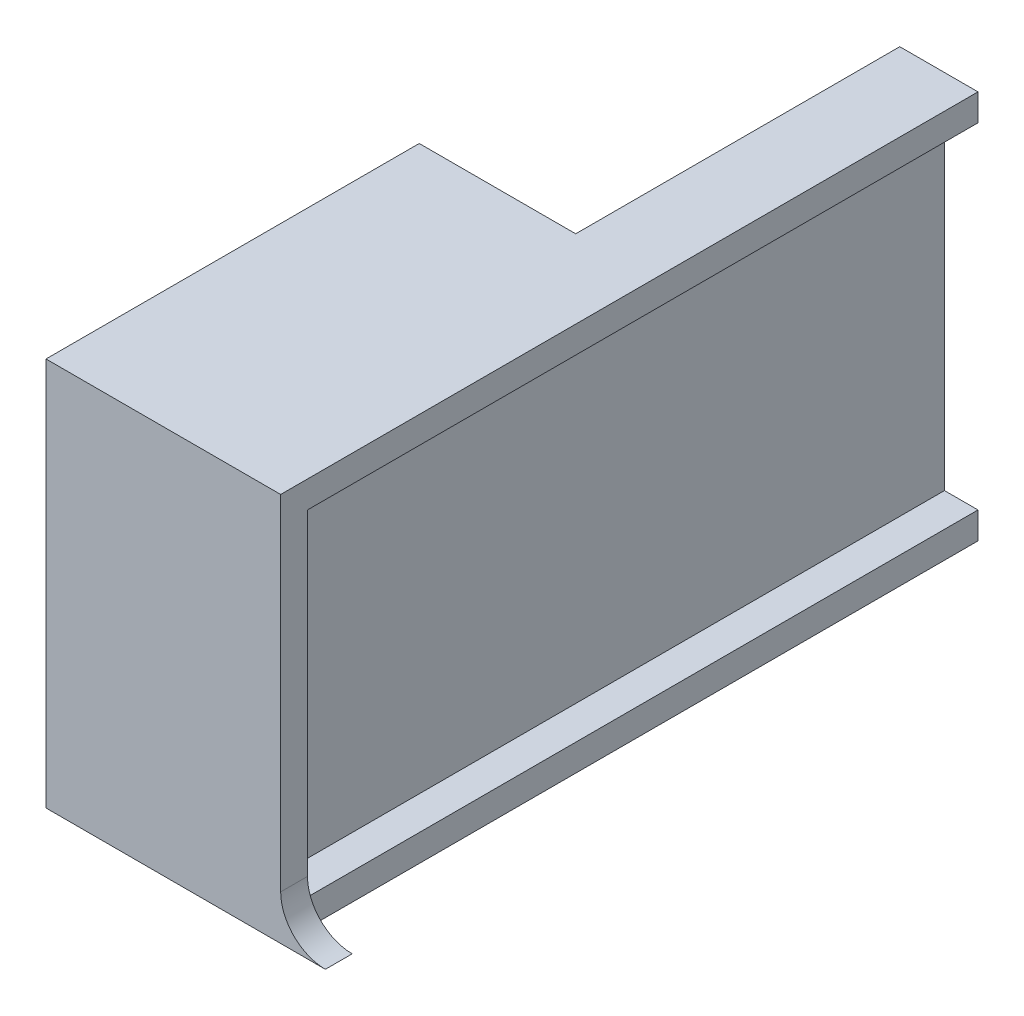
ISO-10303-21;
HEADER;
FILE_DESCRIPTION(('STEP AP214'),'2;1');
FILE_NAME('part.step','',(''),(''),'','','');
FILE_SCHEMA(('AUTOMOTIVE_DESIGN { 1 0 10303 214 1 1 1 1 }'));
ENDSEC;
DATA;
#1=APPLICATION_CONTEXT('core data for automotive mechanical design processes');
#2=APPLICATION_PROTOCOL_DEFINITION('international standard','automotive_design',2000,#1);
#3=PRODUCT_CONTEXT('',#1,'mechanical');
#4=PRODUCT('Part','Part','',(#3));
#5=PRODUCT_RELATED_PRODUCT_CATEGORY('part','',(#4));
#6=PRODUCT_DEFINITION_FORMATION('','',#4);
#7=PRODUCT_DEFINITION_CONTEXT('part definition',#1,'design');
#8=PRODUCT_DEFINITION('design','',#6,#7);
#9=PRODUCT_DEFINITION_SHAPE('','',#8);
#10=(LENGTH_UNIT() NAMED_UNIT(*) SI_UNIT(.MILLI.,.METRE.));
#11=(NAMED_UNIT(*) PLANE_ANGLE_UNIT() SI_UNIT($,.RADIAN.));
#12=(NAMED_UNIT(*) SI_UNIT($,.STERADIAN.) SOLID_ANGLE_UNIT());
#13=UNCERTAINTY_MEASURE_WITH_UNIT(LENGTH_MEASURE(1.E-05),#10,'distance_accuracy_value','');
#14=(GEOMETRIC_REPRESENTATION_CONTEXT(3) GLOBAL_UNCERTAINTY_ASSIGNED_CONTEXT((#13)) GLOBAL_UNIT_ASSIGNED_CONTEXT((#10,
#11,#12)) REPRESENTATION_CONTEXT('',''));
#15=CARTESIAN_POINT('',(0.,0.,0.));
#16=DIRECTION('',(0.,0.,1.));
#17=DIRECTION('',(1.,0.,0.));
#18=AXIS2_PLACEMENT_3D('',#15,#16,#17);
#19=CARTESIAN_POINT('',(0.,0.,-2.8));
#20=DIRECTION('',(0.,0.,-1.));
#21=DIRECTION('',(-1.,0.,0.));
#22=AXIS2_PLACEMENT_3D('',#19,#20,#21);
#23=PLANE('',#22);
#24=CARTESIAN_POINT('',(121.5,65.8,-2.8));
#25=DIRECTION('',(0.,0.,-1.));
#26=DIRECTION('',(-1.,0.,0.));
#27=AXIS2_PLACEMENT_3D('',#24,#25,#26);
#28=CIRCLE('',#27,2.);
#29=CARTESIAN_POINT('',(119.5,65.8,-2.8));
#30=VERTEX_POINT('',#29);
#31=CARTESIAN_POINT('',(121.5,63.8,-2.8));
#32=VERTEX_POINT('',#31);
#33=EDGE_CURVE('E234',#30,#32,#28,.F.);
#34=ORIENTED_EDGE('',*,*,#33,.F.);
#35=DIRECTION('',(0.,1.,0.));
#36=VECTOR('',#35,1.);
#37=CARTESIAN_POINT('',(119.5,84.,-2.8));
#38=LINE('',#37,#36);
#39=CARTESIAN_POINT('',(119.5,81.2,-2.8));
#40=VERTEX_POINT('',#39);
#41=EDGE_CURVE('E242',#30,#40,#38,.T.);
#42=ORIENTED_EDGE('',*,*,#41,.T.);
#43=DIRECTION('',(1.,0.,0.));
#44=VECTOR('',#43,1.);
#45=CARTESIAN_POINT('',(115.25,81.2000000000001,-2.8));
#46=LINE('',#45,#44);
#47=CARTESIAN_POINT('',(109.,81.2,-2.8));
#48=VERTEX_POINT('',#47);
#49=EDGE_CURVE('E11',#48,#40,#46,.T.);
#50=ORIENTED_EDGE('',*,*,#49,.F.);
#51=DIRECTION('',(0.,1.,0.));
#52=VECTOR('',#51,1.);
#53=CARTESIAN_POINT('',(109.,72.5,-2.8));
#54=LINE('',#53,#52);
#55=CARTESIAN_POINT('',(109.,63.8,-2.8));
#56=VERTEX_POINT('',#55);
#57=EDGE_CURVE('E228',#56,#48,#54,.T.);
#58=ORIENTED_EDGE('',*,*,#57,.F.);
#59=DIRECTION('',(-1.,0.,0.));
#60=VECTOR('',#59,1.);
#61=CARTESIAN_POINT('',(115.25,63.8,-2.8));
#62=LINE('',#61,#60);
#63=EDGE_CURVE('E48',#32,#56,#62,.T.);
#64=ORIENTED_EDGE('',*,*,#63,.F.);
#65=EDGE_LOOP('',(#34,#42,#50,#58,#64));
#66=FACE_BOUND('',#65,.T.);
#67=ADVANCED_FACE('F37',(#66),#23,.F.);
#68=CARTESIAN_POINT('',(109.,81.2,-2.8));
#69=DIRECTION('',(0.,1.,0.));
#70=DIRECTION('',(1.,0.,0.));
#71=AXIS2_PLACEMENT_3D('',#68,#69,#70);
#72=PLANE('',#71);
#73=ORIENTED_EDGE('',*,*,#49,.T.);
#74=DIRECTION('',(0.,0.,-1.));
#75=VECTOR('',#74,1.);
#76=CARTESIAN_POINT('',(119.5,81.2,-19.5));
#77=LINE('',#76,#75);
#78=CARTESIAN_POINT('',(119.5,81.2,-34.));
#79=VERTEX_POINT('',#78);
#80=EDGE_CURVE('E215',#40,#79,#77,.T.);
#81=ORIENTED_EDGE('',*,*,#80,.T.);
#82=DIRECTION('',(-1.,0.,0.));
#83=VECTOR('',#82,1.);
#84=CARTESIAN_POINT('',(125.,81.2,-34.));
#85=LINE('',#84,#83);
#86=CARTESIAN_POINT('',(116.,81.2,-34.));
#87=VERTEX_POINT('',#86);
#88=EDGE_CURVE('E207',#79,#87,#85,.T.);
#89=ORIENTED_EDGE('',*,*,#88,.T.);
#90=DIRECTION('',(0.,0.,1.));
#91=VECTOR('',#90,1.);
#92=CARTESIAN_POINT('',(116.,81.2,-46.0598507453451));
#93=LINE('',#92,#91);
#94=CARTESIAN_POINT('',(116.,81.2,-19.5));
#95=VERTEX_POINT('',#94);
#96=EDGE_CURVE('E210',#87,#95,#93,.T.);
#97=ORIENTED_EDGE('',*,*,#96,.T.);
#98=DIRECTION('',(-1.,0.,0.));
#99=VECTOR('',#98,1.);
#100=CARTESIAN_POINT('',(125.,81.2,-19.5));
#101=LINE('',#100,#99);
#102=CARTESIAN_POINT('',(109.,81.2,-19.5));
#103=VERTEX_POINT('',#102);
#104=EDGE_CURVE('E177',#95,#103,#101,.T.);
#105=ORIENTED_EDGE('',*,*,#104,.T.);
#106=DIRECTION('',(0.,0.,-1.));
#107=VECTOR('',#106,1.);
#108=CARTESIAN_POINT('',(109.,81.2,-18.4));
#109=LINE('',#108,#107);
#110=EDGE_CURVE('E164',#48,#103,#109,.T.);
#111=ORIENTED_EDGE('',*,*,#110,.F.);
#112=EDGE_LOOP('',(#73,#81,#89,#97,#105,#111));
#113=FACE_BOUND('',#112,.T.);
#114=ADVANCED_FACE('F259',(#113),#72,.T.);
#115=CARTESIAN_POINT('',(109.,63.8,-2.8));
#116=DIRECTION('',(-1.,0.,0.));
#117=DIRECTION('',(0.,1.,0.));
#118=AXIS2_PLACEMENT_3D('',#115,#116,#117);
#119=PLANE('',#118);
#120=ORIENTED_EDGE('',*,*,#110,.T.);
#121=DIRECTION('',(0.,-1.,0.));
#122=VECTOR('',#121,1.);
#123=CARTESIAN_POINT('',(109.,81.2,-19.5));
#124=LINE('',#123,#122);
#125=CARTESIAN_POINT('',(109.,80.,-19.5));
#126=VERTEX_POINT('',#125);
#127=EDGE_CURVE('E182',#103,#126,#124,.T.);
#128=ORIENTED_EDGE('',*,*,#127,.T.);
#129=DIRECTION('',(0.,0.,1.));
#130=VECTOR('',#129,1.);
#131=CARTESIAN_POINT('',(109.,80.,-19.5));
#132=LINE('',#131,#130);
#133=CARTESIAN_POINT('',(109.,80.,-4.));
#134=VERTEX_POINT('',#133);
#135=EDGE_CURVE('E303',#126,#134,#132,.T.);
#136=ORIENTED_EDGE('',*,*,#135,.T.);
#137=DIRECTION('',(0.,-1.,0.));
#138=VECTOR('',#137,1.);
#139=CARTESIAN_POINT('',(109.,0.,-4.));
#140=LINE('',#139,#138);
#141=CARTESIAN_POINT('',(109.,65.,-4.));
#142=VERTEX_POINT('',#141);
#143=EDGE_CURVE('E238',#134,#142,#140,.T.);
#144=ORIENTED_EDGE('',*,*,#143,.T.);
#145=DIRECTION('',(0.,0.,1.));
#146=VECTOR('',#145,1.);
#147=CARTESIAN_POINT('',(109.,65.,-19.5));
#148=LINE('',#147,#146);
#149=CARTESIAN_POINT('',(109.,65.,-19.5));
#150=VERTEX_POINT('',#149);
#151=EDGE_CURVE('E180',#150,#142,#148,.T.);
#152=ORIENTED_EDGE('',*,*,#151,.F.);
#153=DIRECTION('',(0.,-1.,0.));
#154=VECTOR('',#153,1.);
#155=CARTESIAN_POINT('',(109.,65.,-19.5));
#156=LINE('',#155,#154);
#157=CARTESIAN_POINT('',(109.,63.8,-19.5));
#158=VERTEX_POINT('',#157);
#159=EDGE_CURVE('E191',#150,#158,#156,.T.);
#160=ORIENTED_EDGE('',*,*,#159,.T.);
#161=DIRECTION('',(0.,0.,-1.));
#162=VECTOR('',#161,1.);
#163=CARTESIAN_POINT('',(109.,63.8,-18.4));
#164=LINE('',#163,#162);
#165=EDGE_CURVE('E231',#56,#158,#164,.T.);
#166=ORIENTED_EDGE('',*,*,#165,.F.);
#167=ORIENTED_EDGE('',*,*,#57,.T.);
#168=EDGE_LOOP('',(#120,#128,#136,#144,#152,#160,#166,#167));
#169=FACE_BOUND('',#168,.T.);
#170=ADVANCED_FACE('F264',(#169),#119,.T.);
#171=CARTESIAN_POINT('',(121.5,63.8,-2.8));
#172=DIRECTION('',(0.,-1.,0.));
#173=DIRECTION('',(-1.,0.,0.));
#174=AXIS2_PLACEMENT_3D('',#171,#172,#173);
#175=PLANE('',#174);
#176=ORIENTED_EDGE('',*,*,#165,.T.);
#177=DIRECTION('',(1.,0.,0.));
#178=VECTOR('',#177,1.);
#179=CARTESIAN_POINT('',(125.,63.8,-19.5));
#180=LINE('',#179,#178);
#181=CARTESIAN_POINT('',(116.,63.8,-19.5));
#182=VERTEX_POINT('',#181);
#183=EDGE_CURVE('E188',#158,#182,#180,.T.);
#184=ORIENTED_EDGE('',*,*,#183,.T.);
#185=DIRECTION('',(0.,0.,1.));
#186=VECTOR('',#185,1.);
#187=CARTESIAN_POINT('',(116.,63.8,-46.0598507453451));
#188=LINE('',#187,#186);
#189=CARTESIAN_POINT('',(116.,63.8,-34.));
#190=VERTEX_POINT('',#189);
#191=EDGE_CURVE('E199',#190,#182,#188,.T.);
#192=ORIENTED_EDGE('',*,*,#191,.F.);
#193=DIRECTION('',(1.,0.,0.));
#194=VECTOR('',#193,1.);
#195=CARTESIAN_POINT('',(125.,63.8,-34.));
#196=LINE('',#195,#194);
#197=CARTESIAN_POINT('',(119.5,63.8,-34.));
#198=VERTEX_POINT('',#197);
#199=EDGE_CURVE('E196',#190,#198,#196,.T.);
#200=ORIENTED_EDGE('',*,*,#199,.T.);
#201=DIRECTION('',(0.,0.,1.));
#202=VECTOR('',#201,1.);
#203=CARTESIAN_POINT('',(119.5,63.8,-34.));
#204=LINE('',#203,#202);
#205=CARTESIAN_POINT('',(119.5,63.8,-4.));
#206=VERTEX_POINT('',#205);
#207=EDGE_CURVE('E138',#198,#206,#204,.T.);
#208=ORIENTED_EDGE('',*,*,#207,.T.);
#209=DIRECTION('',(1.,0.,0.));
#210=VECTOR('',#209,1.);
#211=CARTESIAN_POINT('',(0.,63.8,-4.));
#212=LINE('',#211,#210);
#213=CARTESIAN_POINT('',(121.5,63.8,-4.));
#214=VERTEX_POINT('',#213);
#215=EDGE_CURVE('E151',#206,#214,#212,.T.);
#216=ORIENTED_EDGE('',*,*,#215,.T.);
#217=DIRECTION('',(0.,0.,-1.));
#218=VECTOR('',#217,1.);
#219=CARTESIAN_POINT('',(121.5,63.8,0.));
#220=LINE('',#219,#218);
#221=EDGE_CURVE('E244',#214,#32,#220,.F.);
#222=ORIENTED_EDGE('',*,*,#221,.T.);
#223=ORIENTED_EDGE('',*,*,#63,.T.);
#224=EDGE_LOOP('',(#176,#184,#192,#200,#208,#216,#222,#223));
#225=FACE_BOUND('',#224,.T.);
#226=ADVANCED_FACE('F248',(#225),#175,.T.);
#227=CARTESIAN_POINT('',(0.,0.,-4.));
#228=DIRECTION('',(0.,0.,1.));
#229=DIRECTION('',(1.,0.,0.));
#230=AXIS2_PLACEMENT_3D('',#227,#228,#229);
#231=PLANE('',#230);
#232=DIRECTION('',(0.,-1.,0.));
#233=VECTOR('',#232,1.);
#234=CARTESIAN_POINT('',(119.5,84.,-4.));
#235=LINE('',#234,#233);
#236=CARTESIAN_POINT('',(119.5,80.,-4.));
#237=VERTEX_POINT('',#236);
#238=CARTESIAN_POINT('',(119.5,65.8,-4.));
#239=VERTEX_POINT('',#238);
#240=EDGE_CURVE('E163',#237,#239,#235,.T.);
#241=ORIENTED_EDGE('',*,*,#240,.T.);
#242=CARTESIAN_POINT('',(119.5,65.,-4.));
#243=VERTEX_POINT('',#242);
#244=EDGE_CURVE('E41',#239,#243,#235,.T.);
#245=ORIENTED_EDGE('',*,*,#244,.T.);
#246=DIRECTION('',(-1.,0.,0.));
#247=VECTOR('',#246,1.);
#248=CARTESIAN_POINT('',(0.,65.,-4.));
#249=LINE('',#248,#247);
#250=CARTESIAN_POINT('',(118.,65.,-4.));
#251=VERTEX_POINT('',#250);
#252=EDGE_CURVE('E160',#243,#251,#249,.T.);
#253=ORIENTED_EDGE('',*,*,#252,.T.);
#254=DIRECTION('',(0.,1.,0.));
#255=VECTOR('',#254,1.);
#256=CARTESIAN_POINT('',(118.,0.,-4.));
#257=LINE('',#256,#255);
#258=CARTESIAN_POINT('',(118.,80.,-4.));
#259=VERTEX_POINT('',#258);
#260=EDGE_CURVE('E293',#251,#259,#257,.T.);
#261=ORIENTED_EDGE('',*,*,#260,.T.);
#262=DIRECTION('',(1.,0.,0.));
#263=VECTOR('',#262,1.);
#264=CARTESIAN_POINT('',(0.,80.,-4.));
#265=LINE('',#264,#263);
#266=EDGE_CURVE('E301',#259,#237,#265,.T.);
#267=ORIENTED_EDGE('',*,*,#266,.T.);
#268=EDGE_LOOP('',(#241,#245,#253,#261,#267));
#269=FACE_BOUND('',#268,.T.);
#270=ADVANCED_FACE('F157',(#269),#231,.F.);
#271=CARTESIAN_POINT('',(118.,80.,-34.));
#272=DIRECTION('',(1.,0.,0.));
#273=DIRECTION('',(0.,0.,-1.));
#274=AXIS2_PLACEMENT_3D('',#271,#272,#273);
#275=PLANE('',#274);
#276=ORIENTED_EDGE('',*,*,#260,.F.);
#277=DIRECTION('',(0.,0.,1.));
#278=VECTOR('',#277,1.);
#279=CARTESIAN_POINT('',(118.,65.,-34.));
#280=LINE('',#279,#278);
#281=CARTESIAN_POINT('',(118.,65.,-34.));
#282=VERTEX_POINT('',#281);
#283=EDGE_CURVE('E174',#282,#251,#280,.T.);
#284=ORIENTED_EDGE('',*,*,#283,.F.);
#285=DIRECTION('',(0.,1.,0.));
#286=VECTOR('',#285,1.);
#287=CARTESIAN_POINT('',(118.,80.,-34.));
#288=LINE('',#287,#286);
#289=CARTESIAN_POINT('',(118.,80.,-34.));
#290=VERTEX_POINT('',#289);
#291=EDGE_CURVE('E285',#282,#290,#288,.T.);
#292=ORIENTED_EDGE('',*,*,#291,.T.);
#293=DIRECTION('',(0.,0.,1.));
#294=VECTOR('',#293,1.);
#295=CARTESIAN_POINT('',(118.,80.,-34.));
#296=LINE('',#295,#294);
#297=EDGE_CURVE('E290',#290,#259,#296,.T.);
#298=ORIENTED_EDGE('',*,*,#297,.T.);
#299=EDGE_LOOP('',(#276,#284,#292,#298));
#300=FACE_BOUND('',#299,.T.);
#301=ADVANCED_FACE('F328',(#300),#275,.T.);
#302=CARTESIAN_POINT('',(125.,80.,-19.5));
#303=DIRECTION('',(0.,-1.,0.));
#304=DIRECTION('',(0.,0.,-1.));
#305=AXIS2_PLACEMENT_3D('',#302,#303,#304);
#306=PLANE('',#305);
#307=DIRECTION('',(1.,0.,0.));
#308=VECTOR('',#307,1.);
#309=CARTESIAN_POINT('',(125.,80.,-34.));
#310=LINE('',#309,#308);
#311=CARTESIAN_POINT('',(119.5,80.,-34.));
#312=VERTEX_POINT('',#311);
#313=EDGE_CURVE('E203',#290,#312,#310,.T.);
#314=ORIENTED_EDGE('',*,*,#313,.T.);
#315=DIRECTION('',(0.,0.,1.));
#316=VECTOR('',#315,1.);
#317=CARTESIAN_POINT('',(119.5,80.,-19.5));
#318=LINE('',#317,#316);
#319=EDGE_CURVE('E220',#312,#237,#318,.T.);
#320=ORIENTED_EDGE('',*,*,#319,.T.);
#321=ORIENTED_EDGE('',*,*,#266,.F.);
#322=ORIENTED_EDGE('',*,*,#297,.F.);
#323=EDGE_LOOP('',(#314,#320,#321,#322));
#324=FACE_BOUND('',#323,.T.);
#325=ADVANCED_FACE('F331',(#324),#306,.T.);
#326=CARTESIAN_POINT('',(0.,0.,-34.));
#327=DIRECTION('',(0.,0.,1.));
#328=DIRECTION('',(1.,0.,0.));
#329=AXIS2_PLACEMENT_3D('',#326,#327,#328);
#330=PLANE('',#329);
#331=DIRECTION('',(0.,1.,0.));
#332=VECTOR('',#331,1.);
#333=CARTESIAN_POINT('',(119.5,84.,-34.));
#334=LINE('',#333,#332);
#335=CARTESIAN_POINT('',(119.5,65.,-34.));
#336=VERTEX_POINT('',#335);
#337=EDGE_CURVE('E167',#198,#336,#334,.T.);
#338=ORIENTED_EDGE('',*,*,#337,.F.);
#339=ORIENTED_EDGE('',*,*,#199,.F.);
#340=DIRECTION('',(0.,-1.,0.));
#341=VECTOR('',#340,1.);
#342=CARTESIAN_POINT('',(116.,80.,-34.));
#343=LINE('',#342,#341);
#344=EDGE_CURVE('E288',#87,#190,#343,.T.);
#345=ORIENTED_EDGE('',*,*,#344,.F.);
#346=ORIENTED_EDGE('',*,*,#88,.F.);
#347=EDGE_CURVE('E224',#312,#79,#334,.T.);
#348=ORIENTED_EDGE('',*,*,#347,.F.);
#349=ORIENTED_EDGE('',*,*,#313,.F.);
#350=ORIENTED_EDGE('',*,*,#291,.F.);
#351=DIRECTION('',(-1.,0.,0.));
#352=VECTOR('',#351,1.);
#353=CARTESIAN_POINT('',(125.,65.,-34.));
#354=LINE('',#353,#352);
#355=EDGE_CURVE('E197',#336,#282,#354,.T.);
#356=ORIENTED_EDGE('',*,*,#355,.F.);
#357=EDGE_LOOP('',(#338,#339,#345,#346,#348,#349,#350,#356));
#358=FACE_BOUND('',#357,.T.);
#359=ADVANCED_FACE('F324',(#358),#330,.F.);
#360=ORIENTED_EDGE('',*,*,#215,.F.);
#361=DIRECTION('',(0.,-1.,0.));
#362=VECTOR('',#361,1.);
#363=CARTESIAN_POINT('',(119.5,84.,-4.));
#364=LINE('',#363,#362);
#365=EDGE_CURVE('E144',#243,#206,#364,.T.);
#366=ORIENTED_EDGE('',*,*,#365,.F.);
#367=ORIENTED_EDGE('',*,*,#244,.F.);
#368=CARTESIAN_POINT('',(121.5,65.8,-4.));
#369=DIRECTION('',(0.,0.,1.));
#370=DIRECTION('',(1.,0.,0.));
#371=AXIS2_PLACEMENT_3D('',#368,#369,#370);
#372=CIRCLE('',#371,2.);
#373=EDGE_CURVE('E237',#239,#214,#372,.T.);
#374=ORIENTED_EDGE('',*,*,#373,.T.);
#375=EDGE_LOOP('',(#360,#366,#367,#374));
#376=FACE_BOUND('',#375,.T.);
#377=ADVANCED_FACE('F146',(#376),#231,.F.);
#378=CARTESIAN_POINT('',(119.5,84.,-34.));
#379=DIRECTION('',(1.,0.,0.));
#380=DIRECTION('',(0.,0.,-1.));
#381=AXIS2_PLACEMENT_3D('',#378,#379,#380);
#382=PLANE('',#381);
#383=ORIENTED_EDGE('',*,*,#80,.F.);
#384=ORIENTED_EDGE('',*,*,#41,.F.);
#385=DIRECTION('',(0.,0.,-1.));
#386=VECTOR('',#385,1.);
#387=CARTESIAN_POINT('',(119.5,65.8,-34.));
#388=LINE('',#387,#386);
#389=EDGE_CURVE('E154',#30,#239,#388,.T.);
#390=ORIENTED_EDGE('',*,*,#389,.T.);
#391=ORIENTED_EDGE('',*,*,#240,.F.);
#392=ORIENTED_EDGE('',*,*,#319,.F.);
#393=ORIENTED_EDGE('',*,*,#347,.T.);
#394=EDGE_LOOP('',(#383,#384,#390,#391,#392,#393));
#395=FACE_BOUND('',#394,.T.);
#396=ADVANCED_FACE('F254',(#395),#382,.T.);
#397=CARTESIAN_POINT('',(121.5,65.8,-34.));
#398=DIRECTION('',(0.,0.,-1.));
#399=DIRECTION('',(-1.,0.,0.));
#400=AXIS2_PLACEMENT_3D('',#397,#398,#399);
#401=CYLINDRICAL_SURFACE('',#400,2.);
#402=ORIENTED_EDGE('',*,*,#389,.F.);
#403=ORIENTED_EDGE('',*,*,#33,.T.);
#404=ORIENTED_EDGE('',*,*,#221,.F.);
#405=ORIENTED_EDGE('',*,*,#373,.F.);
#406=EDGE_LOOP('',(#402,#403,#404,#405));
#407=FACE_BOUND('',#406,.T.);
#408=ADVANCED_FACE('F39',(#407),#401,.F.);
#409=CARTESIAN_POINT('',(125.,65.,-19.5));
#410=DIRECTION('',(0.,1.,0.));
#411=DIRECTION('',(0.,0.,1.));
#412=AXIS2_PLACEMENT_3D('',#409,#410,#411);
#413=PLANE('',#412);
#414=ORIENTED_EDGE('',*,*,#252,.F.);
#415=DIRECTION('',(0.,0.,-1.));
#416=VECTOR('',#415,1.);
#417=CARTESIAN_POINT('',(119.5,65.,-19.5));
#418=LINE('',#417,#416);
#419=EDGE_CURVE('E153',#243,#336,#418,.T.);
#420=ORIENTED_EDGE('',*,*,#419,.T.);
#421=ORIENTED_EDGE('',*,*,#355,.T.);
#422=ORIENTED_EDGE('',*,*,#283,.T.);
#423=EDGE_LOOP('',(#414,#420,#421,#422));
#424=FACE_BOUND('',#423,.T.);
#425=ADVANCED_FACE('F172',(#424),#413,.T.);
#426=ORIENTED_EDGE('',*,*,#419,.F.);
#427=ORIENTED_EDGE('',*,*,#365,.T.);
#428=ORIENTED_EDGE('',*,*,#207,.F.);
#429=ORIENTED_EDGE('',*,*,#337,.T.);
#430=EDGE_LOOP('',(#426,#427,#428,#429));
#431=FACE_BOUND('',#430,.T.);
#432=ADVANCED_FACE('F166',(#431),#382,.T.);
#433=CARTESIAN_POINT('',(0.,0.,-19.5));
#434=DIRECTION('',(0.,0.,-1.));
#435=DIRECTION('',(-1.,0.,0.));
#436=AXIS2_PLACEMENT_3D('',#433,#434,#435);
#437=PLANE('',#436);
#438=ORIENTED_EDGE('',*,*,#104,.F.);
#439=DIRECTION('',(0.,1.,0.));
#440=VECTOR('',#439,1.);
#441=CARTESIAN_POINT('',(116.,81.2,-19.5));
#442=LINE('',#441,#440);
#443=CARTESIAN_POINT('',(116.,80.,-19.5));
#444=VERTEX_POINT('',#443);
#445=EDGE_CURVE('E212',#444,#95,#442,.T.);
#446=ORIENTED_EDGE('',*,*,#445,.F.);
#447=DIRECTION('',(1.,0.,0.));
#448=VECTOR('',#447,1.);
#449=CARTESIAN_POINT('',(125.,80.,-19.5));
#450=LINE('',#449,#448);
#451=EDGE_CURVE('E305',#126,#444,#450,.T.);
#452=ORIENTED_EDGE('',*,*,#451,.F.);
#453=ORIENTED_EDGE('',*,*,#127,.F.);
#454=EDGE_LOOP('',(#438,#446,#452,#453));
#455=FACE_BOUND('',#454,.T.);
#456=ADVANCED_FACE('F362',(#455),#437,.T.);
#457=CARTESIAN_POINT('',(0.,0.,-19.5));
#458=DIRECTION('',(0.,0.,-1.));
#459=DIRECTION('',(-1.,0.,0.));
#460=AXIS2_PLACEMENT_3D('',#457,#458,#459);
#461=PLANE('',#460);
#462=DIRECTION('',(-1.,0.,0.));
#463=VECTOR('',#462,1.);
#464=CARTESIAN_POINT('',(125.,65.,-19.5));
#465=LINE('',#464,#463);
#466=CARTESIAN_POINT('',(116.,65.,-19.5));
#467=VERTEX_POINT('',#466);
#468=EDGE_CURVE('E194',#467,#150,#465,.T.);
#469=ORIENTED_EDGE('',*,*,#468,.F.);
#470=DIRECTION('',(0.,1.,0.));
#471=VECTOR('',#470,1.);
#472=CARTESIAN_POINT('',(116.,63.8,-19.5));
#473=LINE('',#472,#471);
#474=EDGE_CURVE('E201',#182,#467,#473,.T.);
#475=ORIENTED_EDGE('',*,*,#474,.F.);
#476=ORIENTED_EDGE('',*,*,#183,.F.);
#477=ORIENTED_EDGE('',*,*,#159,.F.);
#478=EDGE_LOOP('',(#469,#475,#476,#477));
#479=FACE_BOUND('',#478,.T.);
#480=ADVANCED_FACE('F275',(#479),#461,.T.);
#481=CARTESIAN_POINT('',(116.,80.,-34.));
#482=DIRECTION('',(-1.,0.,0.));
#483=DIRECTION('',(0.,0.,1.));
#484=AXIS2_PLACEMENT_3D('',#481,#482,#483);
#485=PLANE('',#484);
#486=DIRECTION('',(0.,-1.,0.));
#487=VECTOR('',#486,1.);
#488=CARTESIAN_POINT('',(116.,0.,-4.));
#489=LINE('',#488,#487);
#490=CARTESIAN_POINT('',(116.,80.,-4.));
#491=VERTEX_POINT('',#490);
#492=CARTESIAN_POINT('',(116.,65.,-4.));
#493=VERTEX_POINT('',#492);
#494=EDGE_CURVE('E170',#491,#493,#489,.T.);
#495=ORIENTED_EDGE('',*,*,#494,.F.);
#496=DIRECTION('',(0.,0.,1.));
#497=VECTOR('',#496,1.);
#498=CARTESIAN_POINT('',(116.,80.,-34.));
#499=LINE('',#498,#497);
#500=EDGE_CURVE('E299',#444,#491,#499,.T.);
#501=ORIENTED_EDGE('',*,*,#500,.F.);
#502=ORIENTED_EDGE('',*,*,#445,.T.);
#503=ORIENTED_EDGE('',*,*,#96,.F.);
#504=ORIENTED_EDGE('',*,*,#344,.T.);
#505=ORIENTED_EDGE('',*,*,#191,.T.);
#506=ORIENTED_EDGE('',*,*,#474,.T.);
#507=DIRECTION('',(0.,0.,1.));
#508=VECTOR('',#507,1.);
#509=CARTESIAN_POINT('',(116.,65.,-34.));
#510=LINE('',#509,#508);
#511=EDGE_CURVE('E280',#467,#493,#510,.T.);
#512=ORIENTED_EDGE('',*,*,#511,.T.);
#513=EDGE_LOOP('',(#495,#501,#502,#503,#504,#505,#506,#512));
#514=FACE_BOUND('',#513,.T.);
#515=ADVANCED_FACE('F279',(#514),#485,.T.);
#516=ORIENTED_EDGE('',*,*,#143,.F.);
#517=EDGE_CURVE('E298',#134,#491,#265,.T.);
#518=ORIENTED_EDGE('',*,*,#517,.T.);
#519=ORIENTED_EDGE('',*,*,#494,.T.);
#520=EDGE_CURVE('E176',#493,#142,#249,.T.);
#521=ORIENTED_EDGE('',*,*,#520,.T.);
#522=EDGE_LOOP('',(#516,#518,#519,#521));
#523=FACE_BOUND('',#522,.T.);
#524=ADVANCED_FACE('F344',(#523),#231,.F.);
#525=ORIENTED_EDGE('',*,*,#520,.F.);
#526=ORIENTED_EDGE('',*,*,#511,.F.);
#527=ORIENTED_EDGE('',*,*,#468,.T.);
#528=ORIENTED_EDGE('',*,*,#151,.T.);
#529=EDGE_LOOP('',(#525,#526,#527,#528));
#530=FACE_BOUND('',#529,.T.);
#531=ADVANCED_FACE('F284',(#530),#413,.T.);
#532=ORIENTED_EDGE('',*,*,#517,.F.);
#533=ORIENTED_EDGE('',*,*,#135,.F.);
#534=ORIENTED_EDGE('',*,*,#451,.T.);
#535=ORIENTED_EDGE('',*,*,#500,.T.);
#536=EDGE_LOOP('',(#532,#533,#534,#535));
#537=FACE_BOUND('',#536,.T.);
#538=ADVANCED_FACE('F310',(#537),#306,.T.);
#539=CLOSED_SHELL('',(#67,#114,#170,#226,#270,#301,#325,#359,#377,#396,#408,#425,#432,#456,#480,
#515,#524,#531,#538));
#540=MANIFOLD_SOLID_BREP('B2',#539);
#541=ADVANCED_BREP_SHAPE_REPRESENTATION('',(#18,#540),#14);
#542=SHAPE_DEFINITION_REPRESENTATION(#9,#541);
ENDSEC;
END-ISO-10303-21;
